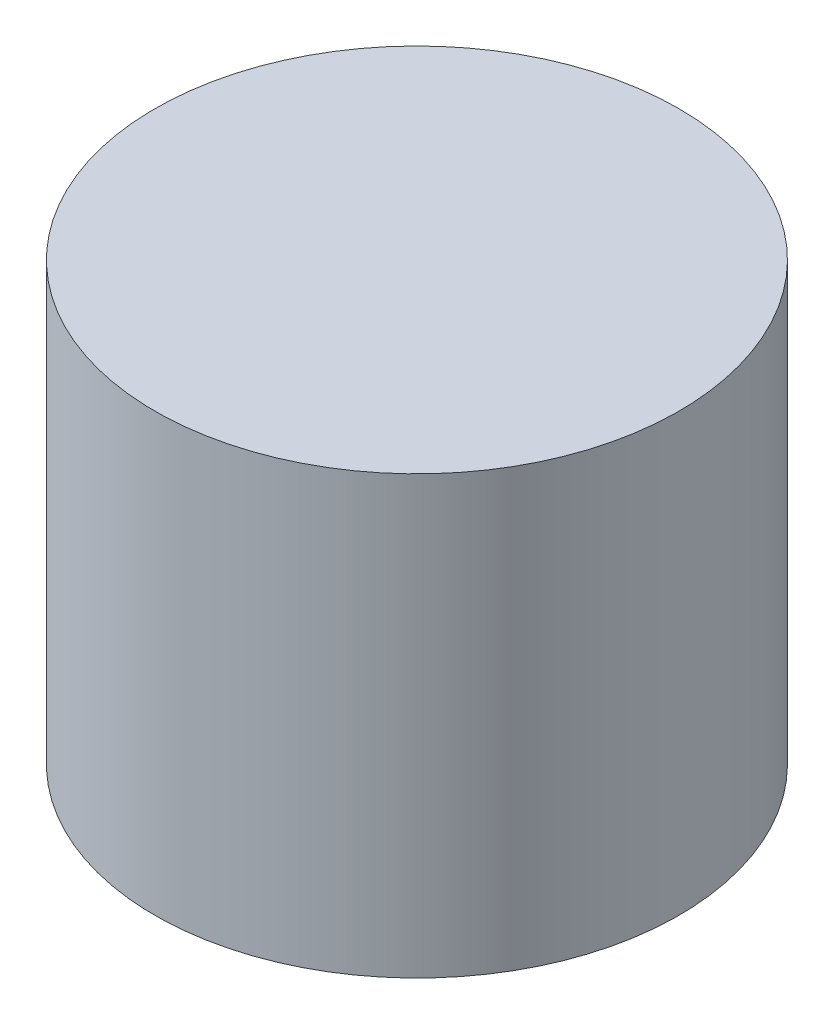
ISO-10303-21;
HEADER;
FILE_DESCRIPTION(('STEP AP214'),'2;1');
FILE_NAME('part.step','',(''),(''),'','','');
FILE_SCHEMA(('AUTOMOTIVE_DESIGN { 1 0 10303 214 1 1 1 1 }'));
ENDSEC;
DATA;
#1=APPLICATION_CONTEXT('core data for automotive mechanical design processes');
#2=APPLICATION_PROTOCOL_DEFINITION('international standard','automotive_design',2000,#1);
#3=PRODUCT_CONTEXT('',#1,'mechanical');
#4=PRODUCT('Part','Part','',(#3));
#5=PRODUCT_RELATED_PRODUCT_CATEGORY('part','',(#4));
#6=PRODUCT_DEFINITION_FORMATION('','',#4);
#7=PRODUCT_DEFINITION_CONTEXT('part definition',#1,'design');
#8=PRODUCT_DEFINITION('design','',#6,#7);
#9=PRODUCT_DEFINITION_SHAPE('','',#8);
#10=(LENGTH_UNIT() NAMED_UNIT(*) SI_UNIT(.MILLI.,.METRE.));
#11=(NAMED_UNIT(*) PLANE_ANGLE_UNIT() SI_UNIT($,.RADIAN.));
#12=(NAMED_UNIT(*) SI_UNIT($,.STERADIAN.) SOLID_ANGLE_UNIT());
#13=UNCERTAINTY_MEASURE_WITH_UNIT(LENGTH_MEASURE(1.E-05),#10,'distance_accuracy_value','');
#14=(GEOMETRIC_REPRESENTATION_CONTEXT(3) GLOBAL_UNCERTAINTY_ASSIGNED_CONTEXT((#13)) GLOBAL_UNIT_ASSIGNED_CONTEXT((#10,
#11,#12)) REPRESENTATION_CONTEXT('',''));
#15=CARTESIAN_POINT('',(0.,0.,0.));
#16=DIRECTION('',(0.,0.,1.));
#17=DIRECTION('',(1.,0.,0.));
#18=AXIS2_PLACEMENT_3D('',#15,#16,#17);
#19=CARTESIAN_POINT('',(6.,0.,0.));
#20=DIRECTION('',(0.,-1.,0.));
#21=DIRECTION('',(0.,0.,-1.));
#22=AXIS2_PLACEMENT_3D('',#19,#20,#21);
#23=PLANE('',#22);
#24=CARTESIAN_POINT('',(0.,0.,0.));
#25=DIRECTION('',(0.,-1.,0.));
#26=DIRECTION('',(0.,0.,-1.));
#27=AXIS2_PLACEMENT_3D('',#24,#25,#26);
#28=CIRCLE('',#27,6.);
#29=CARTESIAN_POINT('',(0.,0.,-6.));
#30=VERTEX_POINT('',#29);
#31=EDGE_CURVE('E37',#30,#30,#28,.T.);
#32=ORIENTED_EDGE('',*,*,#31,.T.);
#33=EDGE_LOOP('',(#32));
#34=FACE_BOUND('',#33,.T.);
#35=ADVANCED_FACE('F31',(#34),#23,.T.);
#36=CARTESIAN_POINT('',(0.,10.,0.));
#37=DIRECTION('',(0.,1.,0.));
#38=DIRECTION('',(0.,0.,1.));
#39=AXIS2_PLACEMENT_3D('',#36,#37,#38);
#40=PLANE('',#39);
#41=CARTESIAN_POINT('',(0.,10.,0.));
#42=DIRECTION('',(0.,-1.,0.));
#43=DIRECTION('',(0.,0.,-1.));
#44=AXIS2_PLACEMENT_3D('',#41,#42,#43);
#45=CIRCLE('',#44,6.);
#46=CARTESIAN_POINT('',(0.,10.,-6.));
#47=VERTEX_POINT('',#46);
#48=EDGE_CURVE('E10',#47,#47,#45,.T.);
#49=ORIENTED_EDGE('',*,*,#48,.F.);
#50=EDGE_LOOP('',(#49));
#51=FACE_BOUND('',#50,.T.);
#52=ADVANCED_FACE('F46',(#51),#40,.T.);
#53=CARTESIAN_POINT('',(0.,-500.,0.));
#54=DIRECTION('',(0.,-1.,0.));
#55=DIRECTION('',(0.,0.,-1.));
#56=AXIS2_PLACEMENT_3D('',#53,#54,#55);
#57=CYLINDRICAL_SURFACE('',#56,6.);
#58=ORIENTED_EDGE('',*,*,#48,.T.);
#59=EDGE_LOOP('',(#58));
#60=FACE_BOUND('',#59,.T.);
#61=ORIENTED_EDGE('',*,*,#31,.F.);
#62=EDGE_LOOP('',(#61));
#63=FACE_BOUND('',#62,.T.);
#64=ADVANCED_FACE('F44',(#60,#63),#57,.T.);
#65=CLOSED_SHELL('',(#35,#52,#64));
#66=MANIFOLD_SOLID_BREP('B2',#65);
#67=ADVANCED_BREP_SHAPE_REPRESENTATION('',(#18,#66),#14);
#68=SHAPE_DEFINITION_REPRESENTATION(#9,#67);
ENDSEC;
END-ISO-10303-21;
